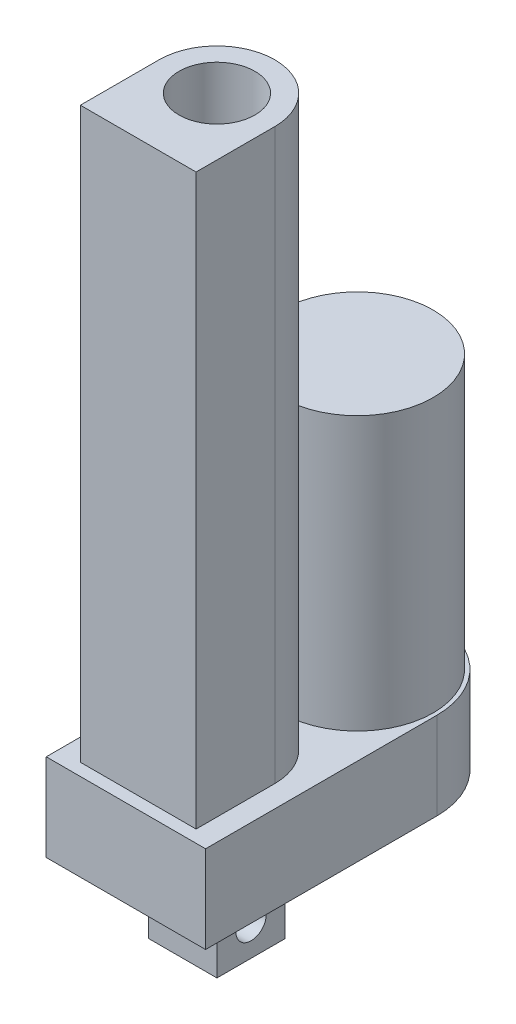
ISO-10303-21;
HEADER;
FILE_DESCRIPTION(('STEP AP214'),'2;1');
FILE_NAME('part.step','',(''),(''),'','','');
FILE_SCHEMA(('AUTOMOTIVE_DESIGN { 1 0 10303 214 1 1 1 1 }'));
ENDSEC;
DATA;
#1=APPLICATION_CONTEXT('core data for automotive mechanical design processes');
#2=APPLICATION_PROTOCOL_DEFINITION('international standard','automotive_design',2000,#1);
#3=PRODUCT_CONTEXT('',#1,'mechanical');
#4=PRODUCT('Part','Part','',(#3));
#5=PRODUCT_RELATED_PRODUCT_CATEGORY('part','',(#4));
#6=PRODUCT_DEFINITION_FORMATION('','',#4);
#7=PRODUCT_DEFINITION_CONTEXT('part definition',#1,'design');
#8=PRODUCT_DEFINITION('design','',#6,#7);
#9=PRODUCT_DEFINITION_SHAPE('','',#8);
#10=(LENGTH_UNIT() NAMED_UNIT(*) SI_UNIT(.MILLI.,.METRE.));
#11=(NAMED_UNIT(*) PLANE_ANGLE_UNIT() SI_UNIT($,.RADIAN.));
#12=(NAMED_UNIT(*) SI_UNIT($,.STERADIAN.) SOLID_ANGLE_UNIT());
#13=UNCERTAINTY_MEASURE_WITH_UNIT(LENGTH_MEASURE(1.E-05),#10,'distance_accuracy_value','');
#14=(GEOMETRIC_REPRESENTATION_CONTEXT(3) GLOBAL_UNCERTAINTY_ASSIGNED_CONTEXT((#13)) GLOBAL_UNIT_ASSIGNED_CONTEXT((#10,
#11,#12)) REPRESENTATION_CONTEXT('',''));
#15=CARTESIAN_POINT('',(0.,0.,0.));
#16=DIRECTION('',(0.,0.,1.));
#17=DIRECTION('',(1.,0.,0.));
#18=AXIS2_PLACEMENT_3D('',#15,#16,#17);
#19=CARTESIAN_POINT('',(0.,-23.,-37.));
#20=DIRECTION('',(0.,1.,0.));
#21=DIRECTION('',(0.,0.,1.));
#22=AXIS2_PLACEMENT_3D('',#19,#20,#21);
#23=PLANE('',#22);
#24=DIRECTION('',(0.,0.,-1.));
#25=VECTOR('',#24,1.);
#26=CARTESIAN_POINT('',(21.,-23.,24.));
#27=LINE('',#26,#25);
#28=CARTESIAN_POINT('',(21.,-23.,24.));
#29=VERTEX_POINT('',#28);
#30=CARTESIAN_POINT('',(21.,-23.,-37.));
#31=VERTEX_POINT('',#30);
#32=EDGE_CURVE('E215',#29,#31,#27,.T.);
#33=ORIENTED_EDGE('',*,*,#32,.F.);
#34=DIRECTION('',(1.,0.,0.));
#35=VECTOR('',#34,1.);
#36=CARTESIAN_POINT('',(-21.,-23.,24.));
#37=LINE('',#36,#35);
#38=CARTESIAN_POINT('',(-21.,-23.,24.));
#39=VERTEX_POINT('',#38);
#40=EDGE_CURVE('E228',#39,#29,#37,.T.);
#41=ORIENTED_EDGE('',*,*,#40,.F.);
#42=DIRECTION('',(0.,0.,1.));
#43=VECTOR('',#42,1.);
#44=CARTESIAN_POINT('',(-21.,-23.,24.));
#45=LINE('',#44,#43);
#46=CARTESIAN_POINT('',(-21.,-23.,-37.));
#47=VERTEX_POINT('',#46);
#48=EDGE_CURVE('E224',#47,#39,#45,.T.);
#49=ORIENTED_EDGE('',*,*,#48,.F.);
#50=CARTESIAN_POINT('',(0.,-23.,-37.));
#51=DIRECTION('',(0.,1.,0.));
#52=DIRECTION('',(0.,0.,1.));
#53=AXIS2_PLACEMENT_3D('',#50,#51,#52);
#54=CIRCLE('',#53,21.);
#55=EDGE_CURVE('E219',#31,#47,#54,.T.);
#56=ORIENTED_EDGE('',*,*,#55,.F.);
#57=EDGE_LOOP('',(#33,#41,#49,#56));
#58=FACE_BOUND('',#57,.T.);
#59=DIRECTION('',(0.,0.,1.));
#60=VECTOR('',#59,1.);
#61=CARTESIAN_POINT('',(9.,-23.,9.));
#62=LINE('',#61,#60);
#63=CARTESIAN_POINT('',(9.,-23.,-9.));
#64=VERTEX_POINT('',#63);
#65=CARTESIAN_POINT('',(9.,-23.,9.));
#66=VERTEX_POINT('',#65);
#67=EDGE_CURVE('E172',#64,#66,#62,.T.);
#68=ORIENTED_EDGE('',*,*,#67,.F.);
#69=DIRECTION('',(1.,0.,0.));
#70=VECTOR('',#69,1.);
#71=CARTESIAN_POINT('',(-9.,-23.,-9.));
#72=LINE('',#71,#70);
#73=CARTESIAN_POINT('',(-9.,-23.,-9.));
#74=VERTEX_POINT('',#73);
#75=EDGE_CURVE('E178',#74,#64,#72,.T.);
#76=ORIENTED_EDGE('',*,*,#75,.F.);
#77=DIRECTION('',(0.,0.,-1.));
#78=VECTOR('',#77,1.);
#79=CARTESIAN_POINT('',(-9.,-23.,9.));
#80=LINE('',#79,#78);
#81=CARTESIAN_POINT('',(-9.,-23.,8.99999999999999));
#82=VERTEX_POINT('',#81);
#83=EDGE_CURVE('E193',#82,#74,#80,.T.);
#84=ORIENTED_EDGE('',*,*,#83,.F.);
#85=DIRECTION('',(-1.,0.,0.));
#86=VECTOR('',#85,1.);
#87=CARTESIAN_POINT('',(-9.,-23.,9.));
#88=LINE('',#87,#86);
#89=EDGE_CURVE('E63',#66,#82,#88,.T.);
#90=ORIENTED_EDGE('',*,*,#89,.F.);
#91=EDGE_LOOP('',(#68,#76,#84,#90));
#92=FACE_BOUND('',#91,.T.);
#93=ADVANCED_FACE('F39',(#58,#92),#23,.F.);
#94=CARTESIAN_POINT('',(21.,-23.,24.));
#95=DIRECTION('',(1.,0.,0.));
#96=DIRECTION('',(0.,0.,-1.));
#97=AXIS2_PLACEMENT_3D('',#94,#95,#96);
#98=PLANE('',#97);
#99=DIRECTION('',(0.,0.,-1.));
#100=VECTOR('',#99,1.);
#101=CARTESIAN_POINT('',(21.,0.,24.));
#102=LINE('',#101,#100);
#103=CARTESIAN_POINT('',(21.,0.,24.));
#104=VERTEX_POINT('',#103);
#105=CARTESIAN_POINT('',(21.,0.,-37.));
#106=VERTEX_POINT('',#105);
#107=EDGE_CURVE('E214',#104,#106,#102,.T.);
#108=ORIENTED_EDGE('',*,*,#107,.F.);
#109=DIRECTION('',(0.,1.,0.));
#110=VECTOR('',#109,1.);
#111=CARTESIAN_POINT('',(21.,-23.,24.));
#112=LINE('',#111,#110);
#113=EDGE_CURVE('E247',#29,#104,#112,.T.);
#114=ORIENTED_EDGE('',*,*,#113,.F.);
#115=ORIENTED_EDGE('',*,*,#32,.T.);
#116=DIRECTION('',(0.,1.,0.));
#117=VECTOR('',#116,1.);
#118=CARTESIAN_POINT('',(21.,-23.,-37.));
#119=LINE('',#118,#117);
#120=EDGE_CURVE('E232',#31,#106,#119,.T.);
#121=ORIENTED_EDGE('',*,*,#120,.T.);
#122=EDGE_LOOP('',(#108,#114,#115,#121));
#123=FACE_BOUND('',#122,.T.);
#124=ADVANCED_FACE('F41',(#123),#98,.T.);
#125=CARTESIAN_POINT('',(-21.,-23.,24.));
#126=DIRECTION('',(0.,0.,1.));
#127=DIRECTION('',(1.,0.,0.));
#128=AXIS2_PLACEMENT_3D('',#125,#126,#127);
#129=PLANE('',#128);
#130=DIRECTION('',(1.,0.,0.));
#131=VECTOR('',#130,1.);
#132=CARTESIAN_POINT('',(-21.,0.,24.));
#133=LINE('',#132,#131);
#134=CARTESIAN_POINT('',(-21.,0.,24.));
#135=VERTEX_POINT('',#134);
#136=EDGE_CURVE('E220',#135,#104,#133,.T.);
#137=ORIENTED_EDGE('',*,*,#136,.F.);
#138=DIRECTION('',(0.,1.,0.));
#139=VECTOR('',#138,1.);
#140=CARTESIAN_POINT('',(-21.,-23.,24.));
#141=LINE('',#140,#139);
#142=EDGE_CURVE('E250',#39,#135,#141,.T.);
#143=ORIENTED_EDGE('',*,*,#142,.F.);
#144=ORIENTED_EDGE('',*,*,#40,.T.);
#145=ORIENTED_EDGE('',*,*,#113,.T.);
#146=EDGE_LOOP('',(#137,#143,#144,#145));
#147=FACE_BOUND('',#146,.T.);
#148=ADVANCED_FACE('F287',(#147),#129,.T.);
#149=CARTESIAN_POINT('',(-21.,-23.,24.));
#150=DIRECTION('',(-1.,0.,0.));
#151=DIRECTION('',(0.,0.,1.));
#152=AXIS2_PLACEMENT_3D('',#149,#150,#151);
#153=PLANE('',#152);
#154=DIRECTION('',(0.,0.,1.));
#155=VECTOR('',#154,1.);
#156=CARTESIAN_POINT('',(-21.,0.,24.));
#157=LINE('',#156,#155);
#158=CARTESIAN_POINT('',(-21.,0.,-37.));
#159=VERTEX_POINT('',#158);
#160=EDGE_CURVE('E240',#159,#135,#157,.T.);
#161=ORIENTED_EDGE('',*,*,#160,.F.);
#162=DIRECTION('',(0.,1.,0.));
#163=VECTOR('',#162,1.);
#164=CARTESIAN_POINT('',(-21.,-23.,-37.));
#165=LINE('',#164,#163);
#166=EDGE_CURVE('E253',#47,#159,#165,.T.);
#167=ORIENTED_EDGE('',*,*,#166,.F.);
#168=ORIENTED_EDGE('',*,*,#48,.T.);
#169=ORIENTED_EDGE('',*,*,#142,.T.);
#170=EDGE_LOOP('',(#161,#167,#168,#169));
#171=FACE_BOUND('',#170,.T.);
#172=ADVANCED_FACE('F285',(#171),#153,.T.);
#173=CARTESIAN_POINT('',(0.,-23.,-37.));
#174=DIRECTION('',(0.,1.,0.));
#175=DIRECTION('',(0.,0.,1.));
#176=AXIS2_PLACEMENT_3D('',#173,#174,#175);
#177=CYLINDRICAL_SURFACE('',#176,21.);
#178=CARTESIAN_POINT('',(0.,0.,-37.));
#179=DIRECTION('',(0.,1.,0.));
#180=DIRECTION('',(0.,0.,1.));
#181=AXIS2_PLACEMENT_3D('',#178,#179,#180);
#182=CIRCLE('',#181,21.);
#183=EDGE_CURVE('E236',#106,#159,#182,.T.);
#184=ORIENTED_EDGE('',*,*,#183,.F.);
#185=ORIENTED_EDGE('',*,*,#120,.F.);
#186=ORIENTED_EDGE('',*,*,#55,.T.);
#187=ORIENTED_EDGE('',*,*,#166,.T.);
#188=EDGE_LOOP('',(#184,#185,#186,#187));
#189=FACE_BOUND('',#188,.T.);
#190=ADVANCED_FACE('F271',(#189),#177,.T.);
#191=CARTESIAN_POINT('',(0.,0.,-37.));
#192=DIRECTION('',(0.,1.,0.));
#193=DIRECTION('',(0.,0.,1.));
#194=AXIS2_PLACEMENT_3D('',#191,#192,#193);
#195=PLANE('',#194);
#196=DIRECTION('',(0.,0.,1.));
#197=VECTOR('',#196,1.);
#198=CARTESIAN_POINT('',(-15.25,0.,0.));
#199=LINE('',#198,#197);
#200=CARTESIAN_POINT('',(-15.25,0.,0.));
#201=VERTEX_POINT('',#200);
#202=CARTESIAN_POINT('',(-15.25,0.,20.75));
#203=VERTEX_POINT('',#202);
#204=EDGE_CURVE('E469',#201,#203,#199,.T.);
#205=ORIENTED_EDGE('',*,*,#204,.F.);
#206=CARTESIAN_POINT('',(0.,0.,0.));
#207=DIRECTION('',(0.,1.,0.));
#208=DIRECTION('',(0.,0.,1.));
#209=AXIS2_PLACEMENT_3D('',#206,#207,#208);
#210=CIRCLE('',#209,15.25);
#211=CARTESIAN_POINT('',(15.25,0.,0.));
#212=VERTEX_POINT('',#211);
#213=EDGE_CURVE('E155',#212,#201,#210,.T.);
#214=ORIENTED_EDGE('',*,*,#213,.F.);
#215=DIRECTION('',(0.,0.,-1.));
#216=VECTOR('',#215,1.);
#217=CARTESIAN_POINT('',(15.25,0.,20.75));
#218=LINE('',#217,#216);
#219=CARTESIAN_POINT('',(15.25,0.,20.75));
#220=VERTEX_POINT('',#219);
#221=EDGE_CURVE('E151',#220,#212,#218,.T.);
#222=ORIENTED_EDGE('',*,*,#221,.F.);
#223=DIRECTION('',(1.,0.,0.));
#224=VECTOR('',#223,1.);
#225=CARTESIAN_POINT('',(-15.25,0.,20.75));
#226=LINE('',#225,#224);
#227=EDGE_CURVE('E479',#203,#220,#226,.T.);
#228=ORIENTED_EDGE('',*,*,#227,.F.);
#229=EDGE_LOOP('',(#205,#214,#222,#228));
#230=FACE_BOUND('',#229,.T.);
#231=CARTESIAN_POINT('',(0.,0.,-37.));
#232=DIRECTION('',(0.,1.,0.));
#233=DIRECTION('',(0.,0.,1.));
#234=AXIS2_PLACEMENT_3D('',#231,#232,#233);
#235=CIRCLE('',#234,20.);
#236=CARTESIAN_POINT('',(0.,0.,-17.));
#237=VERTEX_POINT('',#236);
#238=EDGE_CURVE('E48',#237,#237,#235,.T.);
#239=ORIENTED_EDGE('',*,*,#238,.F.);
#240=EDGE_LOOP('',(#239));
#241=FACE_BOUND('',#240,.T.);
#242=ORIENTED_EDGE('',*,*,#107,.T.);
#243=ORIENTED_EDGE('',*,*,#183,.T.);
#244=ORIENTED_EDGE('',*,*,#160,.T.);
#245=ORIENTED_EDGE('',*,*,#136,.T.);
#246=EDGE_LOOP('',(#242,#243,#244,#245));
#247=FACE_BOUND('',#246,.T.);
#248=ADVANCED_FACE('F267',(#230,#241,#247),#195,.T.);
#249=CARTESIAN_POINT('',(9.,-43.,9.));
#250=DIRECTION('',(-1.,0.,0.));
#251=DIRECTION('',(0.,0.,1.));
#252=AXIS2_PLACEMENT_3D('',#249,#250,#251);
#253=PLANE('',#252);
#254=CARTESIAN_POINT('',(9.,-35.,0.));
#255=DIRECTION('',(-1.,0.,0.));
#256=DIRECTION('',(0.,0.,1.));
#257=AXIS2_PLACEMENT_3D('',#254,#255,#256);
#258=CIRCLE('',#257,4.);
#259=CARTESIAN_POINT('',(9.,-35.,-4.));
#260=VERTEX_POINT('',#259);
#261=EDGE_CURVE('E168',#260,#260,#258,.T.);
#262=ORIENTED_EDGE('',*,*,#261,.T.);
#263=EDGE_LOOP('',(#262));
#264=FACE_BOUND('',#263,.T.);
#265=ORIENTED_EDGE('',*,*,#67,.T.);
#266=DIRECTION('',(0.,1.,0.));
#267=VECTOR('',#266,1.);
#268=CARTESIAN_POINT('',(9.,-43.,9.));
#269=LINE('',#268,#267);
#270=CARTESIAN_POINT('',(9.,-43.,9.));
#271=VERTEX_POINT('',#270);
#272=EDGE_CURVE('E211',#271,#66,#269,.T.);
#273=ORIENTED_EDGE('',*,*,#272,.F.);
#274=DIRECTION('',(0.,0.,1.));
#275=VECTOR('',#274,1.);
#276=CARTESIAN_POINT('',(9.,-43.,9.));
#277=LINE('',#276,#275);
#278=CARTESIAN_POINT('',(9.,-43.,-9.));
#279=VERTEX_POINT('',#278);
#280=EDGE_CURVE('E173',#279,#271,#277,.T.);
#281=ORIENTED_EDGE('',*,*,#280,.F.);
#282=DIRECTION('',(0.,1.,0.));
#283=VECTOR('',#282,1.);
#284=CARTESIAN_POINT('',(9.,-43.,-9.));
#285=LINE('',#284,#283);
#286=EDGE_CURVE('E187',#279,#64,#285,.T.);
#287=ORIENTED_EDGE('',*,*,#286,.T.);
#288=EDGE_LOOP('',(#265,#273,#281,#287));
#289=FACE_BOUND('',#288,.T.);
#290=ADVANCED_FACE('F270',(#264,#289),#253,.F.);
#291=CARTESIAN_POINT('',(-9.,-43.,9.));
#292=DIRECTION('',(0.,0.,-1.));
#293=DIRECTION('',(-1.,0.,0.));
#294=AXIS2_PLACEMENT_3D('',#291,#292,#293);
#295=PLANE('',#294);
#296=ORIENTED_EDGE('',*,*,#89,.T.);
#297=DIRECTION('',(0.,1.,0.));
#298=VECTOR('',#297,1.);
#299=CARTESIAN_POINT('',(-9.,-43.,9.));
#300=LINE('',#299,#298);
#301=CARTESIAN_POINT('',(-9.,-43.,9.));
#302=VERTEX_POINT('',#301);
#303=EDGE_CURVE('E207',#302,#82,#300,.T.);
#304=ORIENTED_EDGE('',*,*,#303,.F.);
#305=DIRECTION('',(-1.,0.,0.));
#306=VECTOR('',#305,1.);
#307=CARTESIAN_POINT('',(-9.,-43.,9.));
#308=LINE('',#307,#306);
#309=EDGE_CURVE('E177',#271,#302,#308,.T.);
#310=ORIENTED_EDGE('',*,*,#309,.F.);
#311=ORIENTED_EDGE('',*,*,#272,.T.);
#312=EDGE_LOOP('',(#296,#304,#310,#311));
#313=FACE_BOUND('',#312,.T.);
#314=ADVANCED_FACE('F307',(#313),#295,.F.);
#315=CARTESIAN_POINT('',(-9.,-43.,9.));
#316=DIRECTION('',(1.,0.,0.));
#317=DIRECTION('',(0.,0.,-1.));
#318=AXIS2_PLACEMENT_3D('',#315,#316,#317);
#319=PLANE('',#318);
#320=CARTESIAN_POINT('',(-9.,-35.,0.));
#321=DIRECTION('',(1.,0.,0.));
#322=DIRECTION('',(0.,0.,-1.));
#323=AXIS2_PLACEMENT_3D('',#320,#321,#322);
#324=CIRCLE('',#323,4.);
#325=CARTESIAN_POINT('',(-9.,-35.,-4.));
#326=VERTEX_POINT('',#325);
#327=EDGE_CURVE('E163',#326,#326,#324,.T.);
#328=ORIENTED_EDGE('',*,*,#327,.T.);
#329=EDGE_LOOP('',(#328));
#330=FACE_BOUND('',#329,.T.);
#331=ORIENTED_EDGE('',*,*,#83,.T.);
#332=DIRECTION('',(0.,1.,0.));
#333=VECTOR('',#332,1.);
#334=CARTESIAN_POINT('',(-9.,-43.,-9.));
#335=LINE('',#334,#333);
#336=CARTESIAN_POINT('',(-9.,-43.,-9.));
#337=VERTEX_POINT('',#336);
#338=EDGE_CURVE('E203',#337,#74,#335,.T.);
#339=ORIENTED_EDGE('',*,*,#338,.F.);
#340=DIRECTION('',(0.,0.,-1.));
#341=VECTOR('',#340,1.);
#342=CARTESIAN_POINT('',(-9.,-43.,9.));
#343=LINE('',#342,#341);
#344=EDGE_CURVE('E181',#302,#337,#343,.T.);
#345=ORIENTED_EDGE('',*,*,#344,.F.);
#346=ORIENTED_EDGE('',*,*,#303,.T.);
#347=EDGE_LOOP('',(#331,#339,#345,#346));
#348=FACE_BOUND('',#347,.T.);
#349=ADVANCED_FACE('F305',(#330,#348),#319,.F.);
#350=CARTESIAN_POINT('',(-9.,-43.,-9.));
#351=DIRECTION('',(0.,0.,1.));
#352=DIRECTION('',(1.,0.,0.));
#353=AXIS2_PLACEMENT_3D('',#350,#351,#352);
#354=PLANE('',#353);
#355=ORIENTED_EDGE('',*,*,#75,.T.);
#356=ORIENTED_EDGE('',*,*,#286,.F.);
#357=DIRECTION('',(1.,0.,0.));
#358=VECTOR('',#357,1.);
#359=CARTESIAN_POINT('',(-9.,-43.,-9.));
#360=LINE('',#359,#358);
#361=EDGE_CURVE('E184',#337,#279,#360,.T.);
#362=ORIENTED_EDGE('',*,*,#361,.F.);
#363=ORIENTED_EDGE('',*,*,#338,.T.);
#364=EDGE_LOOP('',(#355,#356,#362,#363));
#365=FACE_BOUND('',#364,.T.);
#366=ADVANCED_FACE('F296',(#365),#354,.F.);
#367=CARTESIAN_POINT('',(0.,-43.,0.));
#368=DIRECTION('',(0.,-1.,0.));
#369=DIRECTION('',(0.,0.,-1.));
#370=AXIS2_PLACEMENT_3D('',#367,#368,#369);
#371=PLANE('',#370);
#372=ORIENTED_EDGE('',*,*,#280,.T.);
#373=ORIENTED_EDGE('',*,*,#309,.T.);
#374=ORIENTED_EDGE('',*,*,#344,.T.);
#375=ORIENTED_EDGE('',*,*,#361,.T.);
#376=EDGE_LOOP('',(#372,#373,#374,#375));
#377=FACE_BOUND('',#376,.T.);
#378=ADVANCED_FACE('F301',(#377),#371,.T.);
#379=CARTESIAN_POINT('',(-21.,-35.,0.));
#380=DIRECTION('',(1.,0.,0.));
#381=DIRECTION('',(0.,0.,-1.));
#382=AXIS2_PLACEMENT_3D('',#379,#380,#381);
#383=CYLINDRICAL_SURFACE('',#382,4.);
#384=CARTESIAN_POINT('',(-9.,-35.,-4.));
#385=CARTESIAN_POINT('',(-8.8125,-35.,-4.));
#386=CARTESIAN_POINT('',(-8.62499999999999,-35.,-4.));
#387=CARTESIAN_POINT('',(-8.24999999999999,-35.,-4.));
#388=CARTESIAN_POINT('',(-8.0625,-35.,-4.));
#389=CARTESIAN_POINT('',(-7.6875,-35.,-4.));
#390=CARTESIAN_POINT('',(-7.5,-35.,-4.));
#391=CARTESIAN_POINT('',(-7.125,-35.,-4.));
#392=CARTESIAN_POINT('',(-6.9375,-35.,-4.));
#393=CARTESIAN_POINT('',(-6.5625,-35.,-4.));
#394=CARTESIAN_POINT('',(-6.375,-35.,-4.));
#395=CARTESIAN_POINT('',(-6.,-35.,-4.));
#396=CARTESIAN_POINT('',(-5.8125,-35.,-4.));
#397=CARTESIAN_POINT('',(-5.4375,-35.,-4.));
#398=CARTESIAN_POINT('',(-5.25,-35.,-4.));
#399=CARTESIAN_POINT('',(-4.875,-35.,-4.));
#400=CARTESIAN_POINT('',(-4.6875,-35.,-4.));
#401=CARTESIAN_POINT('',(-4.3125,-35.,-4.));
#402=CARTESIAN_POINT('',(-4.125,-35.,-4.));
#403=CARTESIAN_POINT('',(-3.75,-35.,-4.));
#404=CARTESIAN_POINT('',(-3.5625,-35.,-4.));
#405=CARTESIAN_POINT('',(-3.1875,-35.,-4.));
#406=CARTESIAN_POINT('',(-3.,-35.,-4.));
#407=CARTESIAN_POINT('',(-2.625,-35.,-4.));
#408=CARTESIAN_POINT('',(-2.4375,-35.,-4.));
#409=CARTESIAN_POINT('',(-2.0625,-35.,-4.));
#410=CARTESIAN_POINT('',(-1.875,-35.,-4.));
#411=CARTESIAN_POINT('',(-1.5,-35.,-4.));
#412=CARTESIAN_POINT('',(-1.3125,-35.,-4.));
#413=CARTESIAN_POINT('',(-0.937499999999999,-35.,-4.));
#414=CARTESIAN_POINT('',(-0.749999999999999,-35.,-4.));
#415=CARTESIAN_POINT('',(-0.375,-35.,-4.));
#416=CARTESIAN_POINT('',(-0.1875,-35.,-4.));
#417=CARTESIAN_POINT('',(0.1875,-35.,-4.));
#418=CARTESIAN_POINT('',(0.375,-35.,-4.));
#419=CARTESIAN_POINT('',(0.750000000000001,-35.,-4.));
#420=CARTESIAN_POINT('',(0.937500000000001,-35.,-4.));
#421=CARTESIAN_POINT('',(1.3125,-35.,-4.));
#422=CARTESIAN_POINT('',(1.5,-35.,-4.));
#423=CARTESIAN_POINT('',(1.875,-35.,-4.));
#424=CARTESIAN_POINT('',(2.0625,-35.,-4.));
#425=CARTESIAN_POINT('',(2.4375,-35.,-4.));
#426=CARTESIAN_POINT('',(2.625,-35.,-4.));
#427=CARTESIAN_POINT('',(3.,-35.,-4.));
#428=CARTESIAN_POINT('',(3.1875,-35.,-4.));
#429=CARTESIAN_POINT('',(3.5625,-35.,-4.));
#430=CARTESIAN_POINT('',(3.75,-35.,-4.));
#431=CARTESIAN_POINT('',(4.125,-35.,-4.));
#432=CARTESIAN_POINT('',(4.3125,-35.,-4.));
#433=CARTESIAN_POINT('',(4.6875,-35.,-4.));
#434=CARTESIAN_POINT('',(4.875,-35.,-4.));
#435=CARTESIAN_POINT('',(5.25,-35.,-4.));
#436=CARTESIAN_POINT('',(5.4375,-35.,-4.));
#437=CARTESIAN_POINT('',(5.8125,-35.,-4.));
#438=CARTESIAN_POINT('',(6.,-35.,-4.));
#439=CARTESIAN_POINT('',(6.375,-35.,-4.));
#440=CARTESIAN_POINT('',(6.5625,-35.,-4.));
#441=CARTESIAN_POINT('',(6.9375,-35.,-4.));
#442=CARTESIAN_POINT('',(7.125,-35.,-4.));
#443=CARTESIAN_POINT('',(7.5,-35.,-4.));
#444=CARTESIAN_POINT('',(7.6875,-35.,-4.));
#445=CARTESIAN_POINT('',(8.0625,-35.,-4.));
#446=CARTESIAN_POINT('',(8.25,-35.,-4.));
#447=CARTESIAN_POINT('',(8.625,-35.,-4.));
#448=CARTESIAN_POINT('',(8.8125,-35.,-4.));
#449=CARTESIAN_POINT('',(9.,-35.,-4.));
#450=B_SPLINE_CURVE_WITH_KNOTS('',3,(#384,#385,#386,#387,#388,#389,#390,#391,#392,#393,#394,
#395,#396,#397,#398,#399,#400,#401,#402,#403,#404,#405,#406,#407,#408,#409,#410,#411,#412,#413,
#414,#415,#416,#417,#418,#419,#420,#421,#422,#423,#424,#425,#426,#427,#428,#429,#430,#431,#432,
#433,#434,#435,#436,#437,#438,#439,#440,#441,#442,#443,#444,#445,#446,#447,#448,#449),
.UNSPECIFIED.,.F.,.F.,(4,2,2,2,2,2,2,2,2,2,2,2,2,2,2,2,2,2,2,2,2,2,2,2,2,2,2,2,2,2,2,2,4),(0.,
0.5625,1.125,1.6875,2.25,2.8125,3.375,3.9375,4.5,5.0625,5.625,6.1875,6.75,7.3125,7.875,
8.43749999999999,9.,9.5625,10.125,10.6875,11.25,11.8125,12.375,12.9375,13.5,14.0625,14.625,
15.1875,15.75,16.3125,16.875,17.4375,18.),.UNSPECIFIED.);
#451=EDGE_CURVE('BSEAM358',#326,#260,#450,.T.);
#452=ORIENTED_EDGE('',*,*,#327,.F.);
#453=ORIENTED_EDGE('',*,*,#261,.F.);
#454=ORIENTED_EDGE('',*,*,#451,.T.);
#455=ORIENTED_EDGE('',*,*,#451,.F.);
#456=EDGE_LOOP('',(#452,#454,#453,#455));
#457=FACE_BOUND('',#456,.T.);
#458=ADVANCED_FACE('F358',(#457),#383,.F.);
#459=CARTESIAN_POINT('',(0.,72.,-37.));
#460=DIRECTION('',(0.,-1.,0.));
#461=DIRECTION('',(0.,0.,-1.));
#462=AXIS2_PLACEMENT_3D('',#459,#460,#461);
#463=CYLINDRICAL_SURFACE('',#462,20.);
#464=ORIENTED_EDGE('',*,*,#238,.T.);
#465=EDGE_LOOP('',(#464));
#466=FACE_BOUND('',#465,.T.);
#467=CARTESIAN_POINT('',(0.,72.,-37.));
#468=DIRECTION('',(0.,-1.,0.));
#469=DIRECTION('',(0.,0.,-1.));
#470=AXIS2_PLACEMENT_3D('',#467,#468,#469);
#471=CIRCLE('',#470,20.);
#472=CARTESIAN_POINT('',(0.,72.,-57.));
#473=VERTEX_POINT('',#472);
#474=EDGE_CURVE('E158',#473,#473,#471,.T.);
#475=ORIENTED_EDGE('',*,*,#474,.T.);
#476=EDGE_LOOP('',(#475));
#477=FACE_BOUND('',#476,.T.);
#478=ADVANCED_FACE('F264',(#466,#477),#463,.T.);
#479=CARTESIAN_POINT('',(0.,72.,-37.));
#480=DIRECTION('',(0.,-1.,0.));
#481=DIRECTION('',(0.,0.,-1.));
#482=AXIS2_PLACEMENT_3D('',#479,#480,#481);
#483=PLANE('',#482);
#484=ORIENTED_EDGE('',*,*,#474,.F.);
#485=EDGE_LOOP('',(#484));
#486=FACE_BOUND('',#485,.T.);
#487=ADVANCED_FACE('F377',(#486),#483,.F.);
#488=CARTESIAN_POINT('',(0.,150.,0.));
#489=DIRECTION('',(0.,1.,0.));
#490=DIRECTION('',(0.,0.,1.));
#491=AXIS2_PLACEMENT_3D('',#488,#489,#490);
#492=PLANE('',#491);
#493=CARTESIAN_POINT('',(0.,150.,0.));
#494=DIRECTION('',(0.,1.,0.));
#495=DIRECTION('',(0.,0.,1.));
#496=AXIS2_PLACEMENT_3D('',#493,#494,#495);
#497=CIRCLE('',#496,15.25);
#498=CARTESIAN_POINT('',(15.25,150.,0.));
#499=VERTEX_POINT('',#498);
#500=CARTESIAN_POINT('',(-15.25,150.,0.));
#501=VERTEX_POINT('',#500);
#502=EDGE_CURVE('E141',#499,#501,#497,.T.);
#503=ORIENTED_EDGE('',*,*,#502,.T.);
#504=DIRECTION('',(0.,0.,1.));
#505=VECTOR('',#504,1.);
#506=CARTESIAN_POINT('',(-15.25,150.,0.));
#507=LINE('',#506,#505);
#508=CARTESIAN_POINT('',(-15.25,150.,20.75));
#509=VERTEX_POINT('',#508);
#510=EDGE_CURVE('E129',#501,#509,#507,.T.);
#511=ORIENTED_EDGE('',*,*,#510,.T.);
#512=DIRECTION('',(1.,0.,0.));
#513=VECTOR('',#512,1.);
#514=CARTESIAN_POINT('',(-15.25,150.,20.75));
#515=LINE('',#514,#513);
#516=CARTESIAN_POINT('',(15.25,150.,20.75));
#517=VERTEX_POINT('',#516);
#518=EDGE_CURVE('E140',#509,#517,#515,.T.);
#519=ORIENTED_EDGE('',*,*,#518,.T.);
#520=DIRECTION('',(0.,0.,-1.));
#521=VECTOR('',#520,1.);
#522=CARTESIAN_POINT('',(15.25,150.,20.75));
#523=LINE('',#522,#521);
#524=EDGE_CURVE('E146',#517,#499,#523,.T.);
#525=ORIENTED_EDGE('',*,*,#524,.T.);
#526=EDGE_LOOP('',(#503,#511,#519,#525));
#527=FACE_BOUND('',#526,.T.);
#528=CARTESIAN_POINT('',(0.,150.,0.));
#529=DIRECTION('',(0.,1.,0.));
#530=DIRECTION('',(0.,0.,1.));
#531=AXIS2_PLACEMENT_3D('',#528,#529,#530);
#532=CIRCLE('',#531,10.);
#533=CARTESIAN_POINT('',(0.,150.,10.));
#534=VERTEX_POINT('',#533);
#535=EDGE_CURVE('E465',#534,#534,#532,.T.);
#536=ORIENTED_EDGE('',*,*,#535,.F.);
#537=EDGE_LOOP('',(#536));
#538=FACE_BOUND('',#537,.T.);
#539=ADVANCED_FACE('F144',(#527,#538),#492,.T.);
#540=CARTESIAN_POINT('',(0.,150.,0.));
#541=DIRECTION('',(0.,-1.,0.));
#542=DIRECTION('',(0.,0.,-1.));
#543=AXIS2_PLACEMENT_3D('',#540,#541,#542);
#544=CYLINDRICAL_SURFACE('',#543,15.25);
#545=ORIENTED_EDGE('',*,*,#213,.T.);
#546=DIRECTION('',(0.,-1.,0.));
#547=VECTOR('',#546,1.);
#548=CARTESIAN_POINT('',(-15.25,150.,0.));
#549=LINE('',#548,#547);
#550=EDGE_CURVE('E133',#501,#201,#549,.T.);
#551=ORIENTED_EDGE('',*,*,#550,.F.);
#552=ORIENTED_EDGE('',*,*,#502,.F.);
#553=DIRECTION('',(0.,-1.,0.));
#554=VECTOR('',#553,1.);
#555=CARTESIAN_POINT('',(15.25,150.,0.));
#556=LINE('',#555,#554);
#557=EDGE_CURVE('E475',#499,#212,#556,.T.);
#558=ORIENTED_EDGE('',*,*,#557,.T.);
#559=EDGE_LOOP('',(#545,#551,#552,#558));
#560=FACE_BOUND('',#559,.T.);
#561=ADVANCED_FACE('F153',(#560),#544,.T.);
#562=CARTESIAN_POINT('',(-15.25,150.,0.));
#563=DIRECTION('',(1.,0.,0.));
#564=DIRECTION('',(0.,0.,-1.));
#565=AXIS2_PLACEMENT_3D('',#562,#563,#564);
#566=PLANE('',#565);
#567=ORIENTED_EDGE('',*,*,#204,.T.);
#568=DIRECTION('',(0.,-1.,0.));
#569=VECTOR('',#568,1.);
#570=CARTESIAN_POINT('',(-15.25,150.,20.75));
#571=LINE('',#570,#569);
#572=EDGE_CURVE('E136',#509,#203,#571,.T.);
#573=ORIENTED_EDGE('',*,*,#572,.F.);
#574=ORIENTED_EDGE('',*,*,#510,.F.);
#575=ORIENTED_EDGE('',*,*,#550,.T.);
#576=EDGE_LOOP('',(#567,#573,#574,#575));
#577=FACE_BOUND('',#576,.T.);
#578=ADVANCED_FACE('F131',(#577),#566,.F.);
#579=CARTESIAN_POINT('',(-15.25,150.,20.75));
#580=DIRECTION('',(0.,0.,-1.));
#581=DIRECTION('',(-1.,0.,0.));
#582=AXIS2_PLACEMENT_3D('',#579,#580,#581);
#583=PLANE('',#582);
#584=ORIENTED_EDGE('',*,*,#227,.T.);
#585=DIRECTION('',(0.,-1.,0.));
#586=VECTOR('',#585,1.);
#587=CARTESIAN_POINT('',(15.25,150.,20.75));
#588=LINE('',#587,#586);
#589=EDGE_CURVE('E55',#517,#220,#588,.T.);
#590=ORIENTED_EDGE('',*,*,#589,.F.);
#591=ORIENTED_EDGE('',*,*,#518,.F.);
#592=ORIENTED_EDGE('',*,*,#572,.T.);
#593=EDGE_LOOP('',(#584,#590,#591,#592));
#594=FACE_BOUND('',#593,.T.);
#595=ADVANCED_FACE('F406',(#594),#583,.F.);
#596=CARTESIAN_POINT('',(15.25,150.,20.75));
#597=DIRECTION('',(-1.,0.,0.));
#598=DIRECTION('',(0.,0.,1.));
#599=AXIS2_PLACEMENT_3D('',#596,#597,#598);
#600=PLANE('',#599);
#601=ORIENTED_EDGE('',*,*,#221,.T.);
#602=ORIENTED_EDGE('',*,*,#557,.F.);
#603=ORIENTED_EDGE('',*,*,#524,.F.);
#604=ORIENTED_EDGE('',*,*,#589,.T.);
#605=EDGE_LOOP('',(#601,#602,#603,#604));
#606=FACE_BOUND('',#605,.T.);
#607=ADVANCED_FACE('F413',(#606),#600,.F.);
#608=CARTESIAN_POINT('',(0.,150.,0.));
#609=DIRECTION('',(0.,-1.,0.));
#610=DIRECTION('',(0.,0.,-1.));
#611=AXIS2_PLACEMENT_3D('',#608,#609,#610);
#612=CYLINDRICAL_SURFACE('',#611,10.);
#613=ORIENTED_EDGE('',*,*,#535,.T.);
#614=EDGE_LOOP('',(#613));
#615=FACE_BOUND('',#614,.T.);
#616=CARTESIAN_POINT('',(0.,0.,0.));
#617=DIRECTION('',(0.,1.,0.));
#618=DIRECTION('',(0.,0.,1.));
#619=AXIS2_PLACEMENT_3D('',#616,#617,#618);
#620=CIRCLE('',#619,10.);
#621=CARTESIAN_POINT('',(0.,0.,10.));
#622=VERTEX_POINT('',#621);
#623=EDGE_CURVE('E11',#622,#622,#620,.F.);
#624=ORIENTED_EDGE('',*,*,#623,.T.);
#625=EDGE_LOOP('',(#624));
#626=FACE_BOUND('',#625,.T.);
#627=ADVANCED_FACE('F421',(#615,#626),#612,.F.);
#628=ORIENTED_EDGE('',*,*,#623,.F.);
#629=EDGE_LOOP('',(#628));
#630=FACE_BOUND('',#629,.T.);
#631=ADVANCED_FACE('F274',(#630),#195,.T.);
#632=CLOSED_SHELL('',(#93,#124,#148,#172,#190,#248,#290,#314,#349,#366,#378,#458,#478,#487,#539,
#561,#578,#595,#607,#627,#631));
#633=MANIFOLD_SOLID_BREP('B2',#632);
#634=ADVANCED_BREP_SHAPE_REPRESENTATION('',(#18,#633),#14);
#635=SHAPE_DEFINITION_REPRESENTATION(#9,#634);
ENDSEC;
END-ISO-10303-21;
